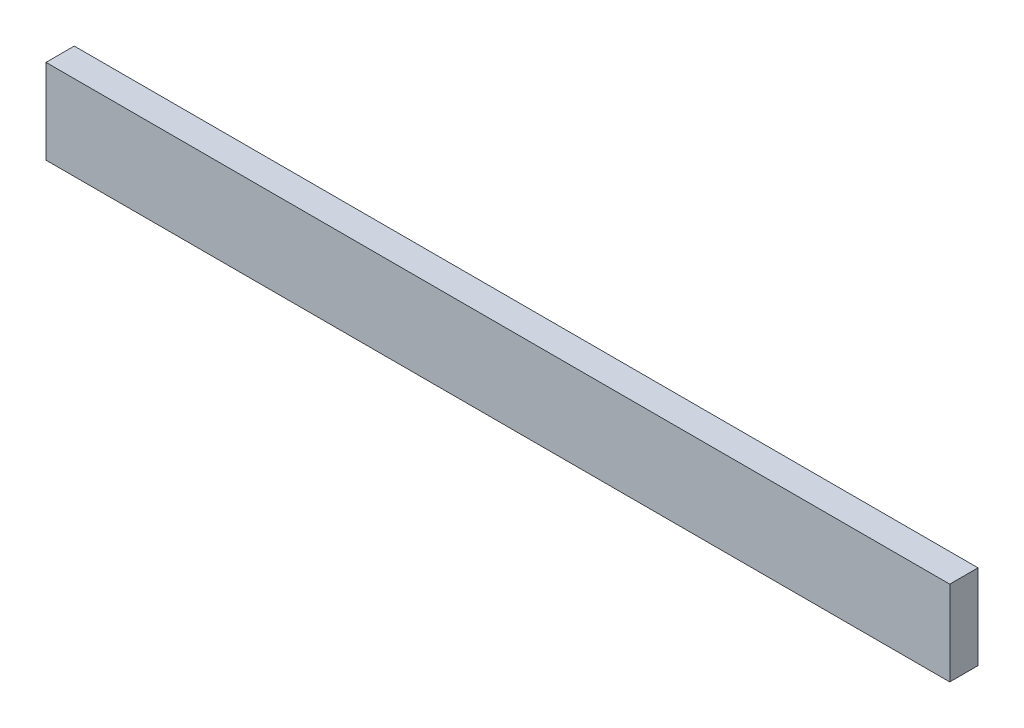
ISO-10303-21;
HEADER;
FILE_DESCRIPTION(('STEP AP214'),'2;1');
FILE_NAME('part.step','',(''),(''),'','','');
FILE_SCHEMA(('AUTOMOTIVE_DESIGN { 1 0 10303 214 1 1 1 1 }'));
ENDSEC;
DATA;
#1=APPLICATION_CONTEXT('core data for automotive mechanical design processes');
#2=APPLICATION_PROTOCOL_DEFINITION('international standard','automotive_design',2000,#1);
#3=PRODUCT_CONTEXT('',#1,'mechanical');
#4=PRODUCT('Part','Part','',(#3));
#5=PRODUCT_RELATED_PRODUCT_CATEGORY('part','',(#4));
#6=PRODUCT_DEFINITION_FORMATION('','',#4);
#7=PRODUCT_DEFINITION_CONTEXT('part definition',#1,'design');
#8=PRODUCT_DEFINITION('design','',#6,#7);
#9=PRODUCT_DEFINITION_SHAPE('','',#8);
#10=(LENGTH_UNIT() NAMED_UNIT(*) SI_UNIT(.MILLI.,.METRE.));
#11=(NAMED_UNIT(*) PLANE_ANGLE_UNIT() SI_UNIT($,.RADIAN.));
#12=(NAMED_UNIT(*) SI_UNIT($,.STERADIAN.) SOLID_ANGLE_UNIT());
#13=UNCERTAINTY_MEASURE_WITH_UNIT(LENGTH_MEASURE(1.E-05),#10,'distance_accuracy_value','');
#14=(GEOMETRIC_REPRESENTATION_CONTEXT(3) GLOBAL_UNCERTAINTY_ASSIGNED_CONTEXT((#13)) GLOBAL_UNIT_ASSIGNED_CONTEXT((#10,
#11,#12)) REPRESENTATION_CONTEXT('',''));
#15=CARTESIAN_POINT('',(0.,0.,0.));
#16=DIRECTION('',(0.,0.,1.));
#17=DIRECTION('',(1.,0.,0.));
#18=AXIS2_PLACEMENT_3D('',#15,#16,#17);
#19=CARTESIAN_POINT('',(-62.0257562144355,3.29734623553751,3.175));
#20=DIRECTION('',(1.,0.,0.));
#21=DIRECTION('',(0.,0.,-1.));
#22=AXIS2_PLACEMENT_3D('',#19,#20,#21);
#23=PLANE('',#22);
#24=DIRECTION('',(0.,-1.,0.));
#25=VECTOR('',#24,1.);
#26=CARTESIAN_POINT('',(-62.0257562144355,3.29734623553751,0.));
#27=LINE('',#26,#25);
#28=CARTESIAN_POINT('',(-62.0257562144355,3.29734623553751,0.));
#29=VERTEX_POINT('',#28);
#30=CARTESIAN_POINT('',(-62.0257562144355,-6.22765376446249,0.));
#31=VERTEX_POINT('',#30);
#32=EDGE_CURVE('E96',#29,#31,#27,.T.);
#33=ORIENTED_EDGE('',*,*,#32,.T.);
#34=DIRECTION('',(0.,0.,-1.));
#35=VECTOR('',#34,1.);
#36=CARTESIAN_POINT('',(-62.0257562144355,-6.22765376446249,3.175));
#37=LINE('',#36,#35);
#38=CARTESIAN_POINT('',(-62.0257562144355,-6.22765376446249,3.175));
#39=VERTEX_POINT('',#38);
#40=EDGE_CURVE('E11',#39,#31,#37,.T.);
#41=ORIENTED_EDGE('',*,*,#40,.F.);
#42=DIRECTION('',(0.,-1.,0.));
#43=VECTOR('',#42,1.);
#44=CARTESIAN_POINT('',(-62.0257562144355,3.29734623553751,3.175));
#45=LINE('',#44,#43);
#46=CARTESIAN_POINT('',(-62.0257562144355,3.29734623553751,3.175));
#47=VERTEX_POINT('',#46);
#48=EDGE_CURVE('E84',#47,#39,#45,.T.);
#49=ORIENTED_EDGE('',*,*,#48,.F.);
#50=DIRECTION('',(0.,0.,-1.));
#51=VECTOR('',#50,1.);
#52=CARTESIAN_POINT('',(-62.0257562144355,3.29734623553751,3.175));
#53=LINE('',#52,#51);
#54=EDGE_CURVE('E92',#47,#29,#53,.T.);
#55=ORIENTED_EDGE('',*,*,#54,.T.);
#56=EDGE_LOOP('',(#33,#41,#49,#55));
#57=FACE_BOUND('',#56,.T.);
#58=ADVANCED_FACE('F33',(#57),#23,.F.);
#59=CARTESIAN_POINT('',(-62.0257562144355,-6.22765376446249,3.175));
#60=DIRECTION('',(0.,1.,0.));
#61=DIRECTION('',(0.,0.,1.));
#62=AXIS2_PLACEMENT_3D('',#59,#60,#61);
#63=PLANE('',#62);
#64=DIRECTION('',(1.,0.,0.));
#65=VECTOR('',#64,1.);
#66=CARTESIAN_POINT('',(-62.0257562144355,-6.22765376446249,0.));
#67=LINE('',#66,#65);
#68=CARTESIAN_POINT('',(39.5742437855645,-6.22765376446249,0.));
#69=VERTEX_POINT('',#68);
#70=EDGE_CURVE('E88',#31,#69,#67,.T.);
#71=ORIENTED_EDGE('',*,*,#70,.T.);
#72=DIRECTION('',(0.,0.,-1.));
#73=VECTOR('',#72,1.);
#74=CARTESIAN_POINT('',(39.5742437855645,-6.22765376446249,3.175));
#75=LINE('',#74,#73);
#76=CARTESIAN_POINT('',(39.5742437855645,-6.22765376446249,3.175));
#77=VERTEX_POINT('',#76);
#78=EDGE_CURVE('E41',#77,#69,#75,.T.);
#79=ORIENTED_EDGE('',*,*,#78,.F.);
#80=DIRECTION('',(1.,0.,0.));
#81=VECTOR('',#80,1.);
#82=CARTESIAN_POINT('',(-62.0257562144355,-6.22765376446249,3.175));
#83=LINE('',#82,#81);
#84=EDGE_CURVE('E79',#39,#77,#83,.T.);
#85=ORIENTED_EDGE('',*,*,#84,.F.);
#86=ORIENTED_EDGE('',*,*,#40,.T.);
#87=EDGE_LOOP('',(#71,#79,#85,#86));
#88=FACE_BOUND('',#87,.T.);
#89=ADVANCED_FACE('F87',(#88),#63,.F.);
#90=CARTESIAN_POINT('',(39.5742437855645,3.29734623553751,3.175));
#91=DIRECTION('',(-1.,0.,0.));
#92=DIRECTION('',(0.,0.,1.));
#93=AXIS2_PLACEMENT_3D('',#90,#91,#92);
#94=PLANE('',#93);
#95=DIRECTION('',(0.,1.,0.));
#96=VECTOR('',#95,1.);
#97=CARTESIAN_POINT('',(39.5742437855645,3.29734623553751,0.));
#98=LINE('',#97,#96);
#99=CARTESIAN_POINT('',(39.5742437855645,3.29734623553751,0.));
#100=VERTEX_POINT('',#99);
#101=EDGE_CURVE('E66',#69,#100,#98,.T.);
#102=ORIENTED_EDGE('',*,*,#101,.T.);
#103=DIRECTION('',(0.,0.,-1.));
#104=VECTOR('',#103,1.);
#105=CARTESIAN_POINT('',(39.5742437855645,3.29734623553751,3.175));
#106=LINE('',#105,#104);
#107=CARTESIAN_POINT('',(39.5742437855645,3.29734623553751,3.175));
#108=VERTEX_POINT('',#107);
#109=EDGE_CURVE('E89',#108,#100,#106,.T.);
#110=ORIENTED_EDGE('',*,*,#109,.F.);
#111=DIRECTION('',(0.,1.,0.));
#112=VECTOR('',#111,1.);
#113=CARTESIAN_POINT('',(39.5742437855645,3.29734623553751,3.175));
#114=LINE('',#113,#112);
#115=EDGE_CURVE('E82',#77,#108,#114,.T.);
#116=ORIENTED_EDGE('',*,*,#115,.F.);
#117=ORIENTED_EDGE('',*,*,#78,.T.);
#118=EDGE_LOOP('',(#102,#110,#116,#117));
#119=FACE_BOUND('',#118,.T.);
#120=ADVANCED_FACE('F90',(#119),#94,.F.);
#121=CARTESIAN_POINT('',(-62.0257562144355,3.29734623553751,3.175));
#122=DIRECTION('',(0.,-1.,0.));
#123=DIRECTION('',(0.,0.,-1.));
#124=AXIS2_PLACEMENT_3D('',#121,#122,#123);
#125=PLANE('',#124);
#126=DIRECTION('',(-1.,0.,0.));
#127=VECTOR('',#126,1.);
#128=CARTESIAN_POINT('',(-62.0257562144355,3.29734623553751,0.));
#129=LINE('',#128,#127);
#130=EDGE_CURVE('E72',#100,#29,#129,.T.);
#131=ORIENTED_EDGE('',*,*,#130,.T.);
#132=ORIENTED_EDGE('',*,*,#54,.F.);
#133=DIRECTION('',(-1.,0.,0.));
#134=VECTOR('',#133,1.);
#135=CARTESIAN_POINT('',(-62.0257562144355,3.29734623553751,3.175));
#136=LINE('',#135,#134);
#137=EDGE_CURVE('E49',#108,#47,#136,.T.);
#138=ORIENTED_EDGE('',*,*,#137,.F.);
#139=ORIENTED_EDGE('',*,*,#109,.T.);
#140=EDGE_LOOP('',(#131,#132,#138,#139));
#141=FACE_BOUND('',#140,.T.);
#142=ADVANCED_FACE('F103',(#141),#125,.F.);
#143=CARTESIAN_POINT('',(0.,0.,3.175));
#144=DIRECTION('',(0.,0.,1.));
#145=DIRECTION('',(1.,0.,0.));
#146=AXIS2_PLACEMENT_3D('',#143,#144,#145);
#147=PLANE('',#146);
#148=ORIENTED_EDGE('',*,*,#48,.T.);
#149=ORIENTED_EDGE('',*,*,#84,.T.);
#150=ORIENTED_EDGE('',*,*,#115,.T.);
#151=ORIENTED_EDGE('',*,*,#137,.T.);
#152=EDGE_LOOP('',(#148,#149,#150,#151));
#153=FACE_BOUND('',#152,.T.);
#154=ADVANCED_FACE('F80',(#153),#147,.T.);
#155=CARTESIAN_POINT('',(0.,0.,0.));
#156=DIRECTION('',(0.,0.,1.));
#157=DIRECTION('',(1.,0.,0.));
#158=AXIS2_PLACEMENT_3D('',#155,#156,#157);
#159=PLANE('',#158);
#160=ORIENTED_EDGE('',*,*,#32,.F.);
#161=ORIENTED_EDGE('',*,*,#130,.F.);
#162=ORIENTED_EDGE('',*,*,#101,.F.);
#163=ORIENTED_EDGE('',*,*,#70,.F.);
#164=EDGE_LOOP('',(#160,#161,#162,#163));
#165=FACE_BOUND('',#164,.T.);
#166=ADVANCED_FACE('F106',(#165),#159,.F.);
#167=CLOSED_SHELL('',(#58,#89,#120,#142,#154,#166));
#168=MANIFOLD_SOLID_BREP('B2',#167);
#169=ADVANCED_BREP_SHAPE_REPRESENTATION('',(#18,#168),#14);
#170=SHAPE_DEFINITION_REPRESENTATION(#9,#169);
ENDSEC;
END-ISO-10303-21;
